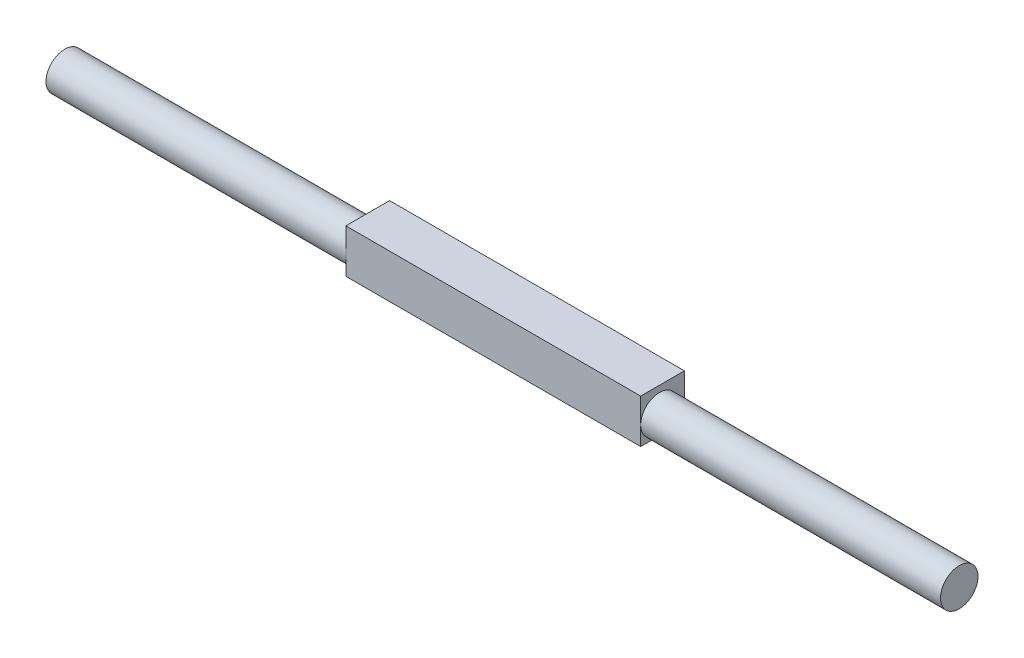
ISO-10303-21;
HEADER;
FILE_DESCRIPTION(('STEP AP214'),'2;1');
FILE_NAME('part.step','',(''),(''),'','','');
FILE_SCHEMA(('AUTOMOTIVE_DESIGN { 1 0 10303 214 1 1 1 1 }'));
ENDSEC;
DATA;
#1=APPLICATION_CONTEXT('core data for automotive mechanical design processes');
#2=APPLICATION_PROTOCOL_DEFINITION('international standard','automotive_design',2000,#1);
#3=PRODUCT_CONTEXT('',#1,'mechanical');
#4=PRODUCT('Part','Part','',(#3));
#5=PRODUCT_RELATED_PRODUCT_CATEGORY('part','',(#4));
#6=PRODUCT_DEFINITION_FORMATION('','',#4);
#7=PRODUCT_DEFINITION_CONTEXT('part definition',#1,'design');
#8=PRODUCT_DEFINITION('design','',#6,#7);
#9=PRODUCT_DEFINITION_SHAPE('','',#8);
#10=(LENGTH_UNIT() NAMED_UNIT(*) SI_UNIT(.MILLI.,.METRE.));
#11=(NAMED_UNIT(*) PLANE_ANGLE_UNIT() SI_UNIT($,.RADIAN.));
#12=(NAMED_UNIT(*) SI_UNIT($,.STERADIAN.) SOLID_ANGLE_UNIT());
#13=UNCERTAINTY_MEASURE_WITH_UNIT(LENGTH_MEASURE(1.E-05),#10,'distance_accuracy_value','');
#14=(GEOMETRIC_REPRESENTATION_CONTEXT(3) GLOBAL_UNCERTAINTY_ASSIGNED_CONTEXT((#13)) GLOBAL_UNIT_ASSIGNED_CONTEXT((#10,
#11,#12)) REPRESENTATION_CONTEXT('',''));
#15=CARTESIAN_POINT('',(0.,0.,0.));
#16=DIRECTION('',(0.,0.,1.));
#17=DIRECTION('',(1.,0.,0.));
#18=AXIS2_PLACEMENT_3D('',#15,#16,#17);
#19=CARTESIAN_POINT('',(12.8632030617518,2.4393600772849,5.99576124143884));
#20=DIRECTION('',(-1.,0.,0.));
#21=DIRECTION('',(0.,0.,1.));
#22=AXIS2_PLACEMENT_3D('',#19,#20,#21);
#23=CYLINDRICAL_SURFACE('',#22,0.375);
#24=CARTESIAN_POINT('',(12.8632030617518,2.4393600772849,5.99576124143884));
#25=DIRECTION('',(1.,0.,0.));
#26=DIRECTION('',(0.,0.,-1.));
#27=AXIS2_PLACEMENT_3D('',#24,#25,#26);
#28=CIRCLE('',#27,0.375);
#29=CARTESIAN_POINT('',(12.8632030617518,2.4393600772849,5.62076124143884));
#30=VERTEX_POINT('',#29);
#31=EDGE_CURVE('P0_E10',#30,#30,#28,.T.);
#32=ORIENTED_EDGE('',*,*,#31,.F.);
#33=EDGE_LOOP('',(#32));
#34=FACE_BOUND('',#33,.T.);
#35=CARTESIAN_POINT('',(6.86320306175179,2.4393600772849,5.99576124143884));
#36=DIRECTION('',(1.,0.,0.));
#37=DIRECTION('',(0.,0.,-1.));
#38=AXIS2_PLACEMENT_3D('',#35,#36,#37);
#39=CIRCLE('',#38,0.375);
#40=CARTESIAN_POINT('',(6.86320306175179,2.4393600772849,5.62076124143884));
#41=VERTEX_POINT('',#40);
#42=EDGE_CURVE('P0_E18',#41,#41,#39,.T.);
#43=ORIENTED_EDGE('',*,*,#42,.T.);
#44=EDGE_LOOP('',(#43));
#45=FACE_BOUND('',#44,.T.);
#46=ADVANCED_FACE('P0_F15',(#34,#45),#23,.T.);
#47=CARTESIAN_POINT('',(12.8632030617518,2.4393600772849,5.99576124143884));
#48=DIRECTION('',(1.,0.,0.));
#49=DIRECTION('',(0.,0.,-1.));
#50=AXIS2_PLACEMENT_3D('',#47,#48,#49);
#51=PLANE('',#50);
#52=ORIENTED_EDGE('',*,*,#31,.T.);
#53=EDGE_LOOP('',(#52));
#54=FACE_BOUND('',#53,.T.);
#55=ADVANCED_FACE('P0_F30',(#54),#51,.T.);
#56=CARTESIAN_POINT('',(6.86320306175179,2.4393600772849,5.99576124143884));
#57=DIRECTION('',(1.,0.,0.));
#58=DIRECTION('',(0.,0.,-1.));
#59=AXIS2_PLACEMENT_3D('',#56,#57,#58);
#60=PLANE('',#59);
#61=ORIENTED_EDGE('',*,*,#42,.F.);
#62=EDGE_LOOP('',(#61));
#63=FACE_BOUND('',#62,.T.);
#64=ADVANCED_FACE('P0_F28',(#63),#60,.F.);
#65=CLOSED_SHELL('',(#46,#55,#64));
#66=MANIFOLD_SOLID_BREP('P0_B1',#65);
#67=CARTESIAN_POINT('',(0.963203061751793,2.4393600772849,5.99576124143884));
#68=DIRECTION('',(-1.,0.,0.));
#69=DIRECTION('',(0.,0.,-1.));
#70=AXIS2_PLACEMENT_3D('',#67,#68,#69);
#71=CYLINDRICAL_SURFACE('',#70,0.375);
#72=CARTESIAN_POINT('',(0.963203061751793,2.4393600772849,5.99576124143884));
#73=DIRECTION('',(1.,0.,0.));
#74=DIRECTION('',(0.,0.,1.));
#75=AXIS2_PLACEMENT_3D('',#72,#73,#74);
#76=CIRCLE('',#75,0.375);
#77=CARTESIAN_POINT('',(0.963203061751793,2.4393600772849,6.37076124143884));
#78=VERTEX_POINT('',#77);
#79=EDGE_CURVE('P1_E10',#78,#78,#76,.T.);
#80=ORIENTED_EDGE('',*,*,#79,.F.);
#81=EDGE_LOOP('',(#80));
#82=FACE_BOUND('',#81,.T.);
#83=CARTESIAN_POINT('',(-5.03679693824821,2.4393600772849,5.99576124143884));
#84=DIRECTION('',(1.,0.,0.));
#85=DIRECTION('',(0.,0.,1.));
#86=AXIS2_PLACEMENT_3D('',#83,#84,#85);
#87=CIRCLE('',#86,0.375);
#88=CARTESIAN_POINT('',(-5.03679693824821,2.4393600772849,6.37076124143884));
#89=VERTEX_POINT('',#88);
#90=EDGE_CURVE('P1_E18',#89,#89,#87,.T.);
#91=ORIENTED_EDGE('',*,*,#90,.T.);
#92=EDGE_LOOP('',(#91));
#93=FACE_BOUND('',#92,.T.);
#94=ADVANCED_FACE('P1_F15',(#82,#93),#71,.T.);
#95=CARTESIAN_POINT('',(0.963203061751793,2.4393600772849,5.99576124143884));
#96=DIRECTION('',(1.,0.,0.));
#97=DIRECTION('',(0.,0.,1.));
#98=AXIS2_PLACEMENT_3D('',#95,#96,#97);
#99=PLANE('',#98);
#100=ORIENTED_EDGE('',*,*,#79,.T.);
#101=EDGE_LOOP('',(#100));
#102=FACE_BOUND('',#101,.T.);
#103=ADVANCED_FACE('P1_F30',(#102),#99,.T.);
#104=CARTESIAN_POINT('',(-5.03679693824821,2.4393600772849,5.99576124143884));
#105=DIRECTION('',(1.,0.,0.));
#106=DIRECTION('',(0.,0.,1.));
#107=AXIS2_PLACEMENT_3D('',#104,#105,#106);
#108=PLANE('',#107);
#109=ORIENTED_EDGE('',*,*,#90,.F.);
#110=EDGE_LOOP('',(#109));
#111=FACE_BOUND('',#110,.T.);
#112=ADVANCED_FACE('P1_F28',(#111),#108,.F.);
#113=CLOSED_SHELL('',(#94,#103,#112));
#114=MANIFOLD_SOLID_BREP('P1_B1',#113);
#115=CARTESIAN_POINT('',(0.963203061751793,2.9393600772849,5.49576124143884));
#116=DIRECTION('',(1.,0.,0.));
#117=DIRECTION('',(0.,0.,-1.));
#118=AXIS2_PLACEMENT_3D('',#115,#116,#117);
#119=PLANE('',#118);
#120=DIRECTION('',(0.,0.,1.));
#121=VECTOR('',#120,1.);
#122=CARTESIAN_POINT('',(0.963203061751793,2.0643600772849,5.49576124143884));
#123=LINE('',#122,#121);
#124=CARTESIAN_POINT('',(0.963203061751793,2.0643600772849,5.49576124143884));
#125=VERTEX_POINT('',#124);
#126=CARTESIAN_POINT('',(0.963203061751793,2.0643600772849,6.37076124143884));
#127=VERTEX_POINT('',#126);
#128=EDGE_CURVE('P2_E79',#125,#127,#123,.T.);
#129=ORIENTED_EDGE('',*,*,#128,.T.);
#130=DIRECTION('',(0.,-1.,0.));
#131=VECTOR('',#130,1.);
#132=CARTESIAN_POINT('',(0.963203061751793,2.9393600772849,6.37076124143884));
#133=LINE('',#132,#131);
#134=CARTESIAN_POINT('',(0.963203061751793,2.9393600772849,6.37076124143884));
#135=VERTEX_POINT('',#134);
#136=EDGE_CURVE('P2_E10',#135,#127,#133,.T.);
#137=ORIENTED_EDGE('',*,*,#136,.F.);
#138=DIRECTION('',(0.,0.,1.));
#139=VECTOR('',#138,1.);
#140=CARTESIAN_POINT('',(0.963203061751793,2.9393600772849,5.49576124143884));
#141=LINE('',#140,#139);
#142=CARTESIAN_POINT('',(0.963203061751793,2.9393600772849,5.49576124143884));
#143=VERTEX_POINT('',#142);
#144=EDGE_CURVE('P2_E67',#143,#135,#141,.T.);
#145=ORIENTED_EDGE('',*,*,#144,.F.);
#146=DIRECTION('',(0.,-1.,0.));
#147=VECTOR('',#146,1.);
#148=CARTESIAN_POINT('',(0.963203061751793,2.9393600772849,5.49576124143884));
#149=LINE('',#148,#147);
#150=EDGE_CURVE('P2_E75',#143,#125,#149,.T.);
#151=ORIENTED_EDGE('',*,*,#150,.T.);
#152=EDGE_LOOP('',(#129,#137,#145,#151));
#153=FACE_BOUND('',#152,.T.);
#154=ADVANCED_FACE('P2_F16',(#153),#119,.F.);
#155=CARTESIAN_POINT('',(0.963203061751793,2.9393600772849,6.37076124143884));
#156=DIRECTION('',(0.,0.,-1.));
#157=DIRECTION('',(-1.,0.,0.));
#158=AXIS2_PLACEMENT_3D('',#155,#156,#157);
#159=PLANE('',#158);
#160=DIRECTION('',(1.,0.,0.));
#161=VECTOR('',#160,1.);
#162=CARTESIAN_POINT('',(0.963203061751793,2.0643600772849,6.37076124143884));
#163=LINE('',#162,#161);
#164=CARTESIAN_POINT('',(6.86320306175179,2.0643600772849,6.37076124143884));
#165=VERTEX_POINT('',#164);
#166=EDGE_CURVE('P2_E71',#127,#165,#163,.T.);
#167=ORIENTED_EDGE('',*,*,#166,.T.);
#168=DIRECTION('',(0.,-1.,0.));
#169=VECTOR('',#168,1.);
#170=CARTESIAN_POINT('',(6.86320306175179,2.9393600772849,6.37076124143884));
#171=LINE('',#170,#169);
#172=CARTESIAN_POINT('',(6.86320306175179,2.9393600772849,6.37076124143884));
#173=VERTEX_POINT('',#172);
#174=EDGE_CURVE('P2_E24',#173,#165,#171,.T.);
#175=ORIENTED_EDGE('',*,*,#174,.F.);
#176=DIRECTION('',(1.,0.,0.));
#177=VECTOR('',#176,1.);
#178=CARTESIAN_POINT('',(0.963203061751793,2.9393600772849,6.37076124143884));
#179=LINE('',#178,#177);
#180=EDGE_CURVE('P2_E62',#135,#173,#179,.T.);
#181=ORIENTED_EDGE('',*,*,#180,.F.);
#182=ORIENTED_EDGE('',*,*,#136,.T.);
#183=EDGE_LOOP('',(#167,#175,#181,#182));
#184=FACE_BOUND('',#183,.T.);
#185=ADVANCED_FACE('P2_F70',(#184),#159,.F.);
#186=CARTESIAN_POINT('',(6.86320306175179,2.9393600772849,5.49576124143884));
#187=DIRECTION('',(-1.,0.,0.));
#188=DIRECTION('',(0.,0.,1.));
#189=AXIS2_PLACEMENT_3D('',#186,#187,#188);
#190=PLANE('',#189);
#191=DIRECTION('',(0.,0.,-1.));
#192=VECTOR('',#191,1.);
#193=CARTESIAN_POINT('',(6.86320306175179,2.0643600772849,5.49576124143884));
#194=LINE('',#193,#192);
#195=CARTESIAN_POINT('',(6.86320306175179,2.0643600772849,5.49576124143884));
#196=VERTEX_POINT('',#195);
#197=EDGE_CURVE('P2_E49',#165,#196,#194,.T.);
#198=ORIENTED_EDGE('',*,*,#197,.T.);
#199=DIRECTION('',(0.,-1.,0.));
#200=VECTOR('',#199,1.);
#201=CARTESIAN_POINT('',(6.86320306175179,2.9393600772849,5.49576124143884));
#202=LINE('',#201,#200);
#203=CARTESIAN_POINT('',(6.86320306175179,2.9393600772849,5.49576124143884));
#204=VERTEX_POINT('',#203);
#205=EDGE_CURVE('P2_E72',#204,#196,#202,.T.);
#206=ORIENTED_EDGE('',*,*,#205,.F.);
#207=DIRECTION('',(0.,0.,-1.));
#208=VECTOR('',#207,1.);
#209=CARTESIAN_POINT('',(6.86320306175179,2.9393600772849,5.49576124143884));
#210=LINE('',#209,#208);
#211=EDGE_CURVE('P2_E65',#173,#204,#210,.T.);
#212=ORIENTED_EDGE('',*,*,#211,.F.);
#213=ORIENTED_EDGE('',*,*,#174,.T.);
#214=EDGE_LOOP('',(#198,#206,#212,#213));
#215=FACE_BOUND('',#214,.T.);
#216=ADVANCED_FACE('P2_F73',(#215),#190,.F.);
#217=CARTESIAN_POINT('',(0.963203061751793,2.9393600772849,5.49576124143884));
#218=DIRECTION('',(0.,0.,1.));
#219=DIRECTION('',(1.,0.,0.));
#220=AXIS2_PLACEMENT_3D('',#217,#218,#219);
#221=PLANE('',#220);
#222=DIRECTION('',(-1.,0.,0.));
#223=VECTOR('',#222,1.);
#224=CARTESIAN_POINT('',(0.963203061751793,2.0643600772849,5.49576124143884));
#225=LINE('',#224,#223);
#226=EDGE_CURVE('P2_E55',#196,#125,#225,.T.);
#227=ORIENTED_EDGE('',*,*,#226,.T.);
#228=ORIENTED_EDGE('',*,*,#150,.F.);
#229=DIRECTION('',(-1.,0.,0.));
#230=VECTOR('',#229,1.);
#231=CARTESIAN_POINT('',(0.963203061751793,2.9393600772849,5.49576124143884));
#232=LINE('',#231,#230);
#233=EDGE_CURVE('P2_E32',#204,#143,#232,.T.);
#234=ORIENTED_EDGE('',*,*,#233,.F.);
#235=ORIENTED_EDGE('',*,*,#205,.T.);
#236=EDGE_LOOP('',(#227,#228,#234,#235));
#237=FACE_BOUND('',#236,.T.);
#238=ADVANCED_FACE('P2_F86',(#237),#221,.F.);
#239=CARTESIAN_POINT('',(0.963203061751793,2.9393600772849,5.49576124143884));
#240=DIRECTION('',(0.,1.,0.));
#241=DIRECTION('',(0.,0.,1.));
#242=AXIS2_PLACEMENT_3D('',#239,#240,#241);
#243=PLANE('',#242);
#244=ORIENTED_EDGE('',*,*,#144,.T.);
#245=ORIENTED_EDGE('',*,*,#180,.T.);
#246=ORIENTED_EDGE('',*,*,#211,.T.);
#247=ORIENTED_EDGE('',*,*,#233,.T.);
#248=EDGE_LOOP('',(#244,#245,#246,#247));
#249=FACE_BOUND('',#248,.T.);
#250=ADVANCED_FACE('P2_F63',(#249),#243,.T.);
#251=CARTESIAN_POINT('',(0.963203061751793,2.0643600772849,5.49576124143884));
#252=DIRECTION('',(0.,1.,0.));
#253=DIRECTION('',(0.,0.,1.));
#254=AXIS2_PLACEMENT_3D('',#251,#252,#253);
#255=PLANE('',#254);
#256=ORIENTED_EDGE('',*,*,#128,.F.);
#257=ORIENTED_EDGE('',*,*,#226,.F.);
#258=ORIENTED_EDGE('',*,*,#197,.F.);
#259=ORIENTED_EDGE('',*,*,#166,.F.);
#260=EDGE_LOOP('',(#256,#257,#258,#259));
#261=FACE_BOUND('',#260,.T.);
#262=ADVANCED_FACE('P2_F89',(#261),#255,.F.);
#263=CLOSED_SHELL('',(#154,#185,#216,#238,#250,#262));
#264=MANIFOLD_SOLID_BREP('P2_B1',#263);
#265=ADVANCED_BREP_SHAPE_REPRESENTATION('',(#18,#66,#114,#264),#14);
#266=SHAPE_DEFINITION_REPRESENTATION(#9,#265);
ENDSEC;
END-ISO-10303-21;
